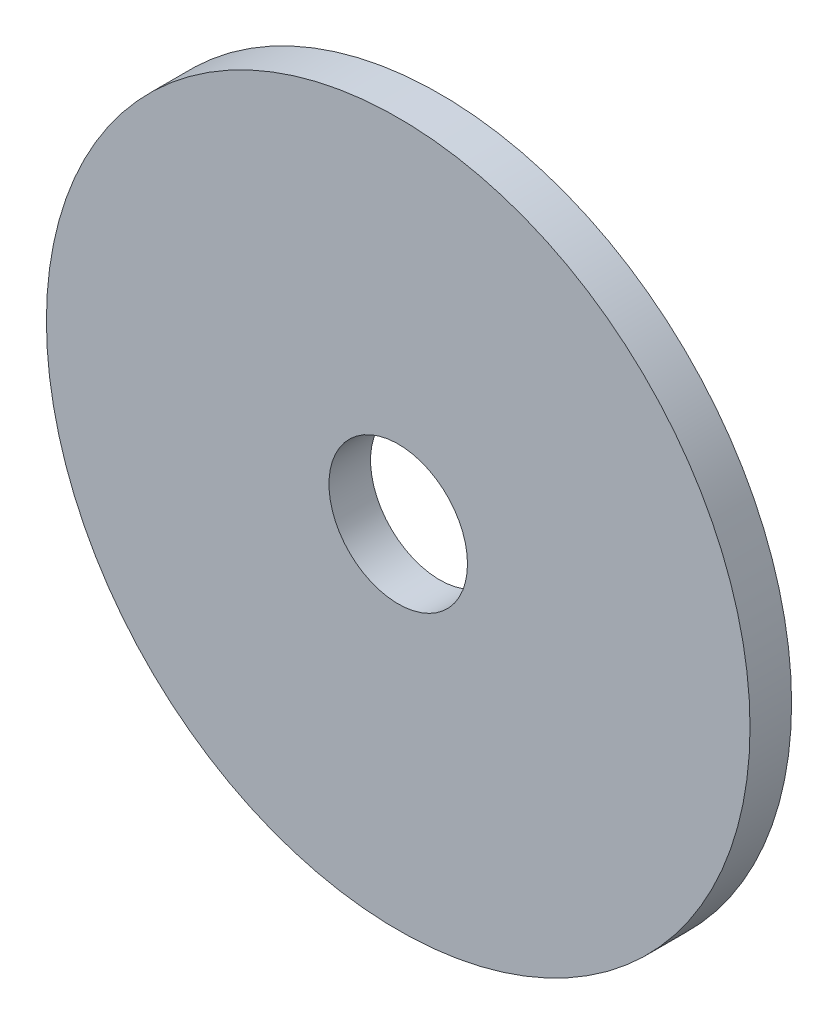
ISO-10303-21;
HEADER;
FILE_DESCRIPTION(('STEP AP214'),'2;1');
FILE_NAME('part.step','',(''),(''),'','','');
FILE_SCHEMA(('AUTOMOTIVE_DESIGN { 1 0 10303 214 1 1 1 1 }'));
ENDSEC;
DATA;
#1=APPLICATION_CONTEXT('core data for automotive mechanical design processes');
#2=APPLICATION_PROTOCOL_DEFINITION('international standard','automotive_design',2000,#1);
#3=PRODUCT_CONTEXT('',#1,'mechanical');
#4=PRODUCT('Part','Part','',(#3));
#5=PRODUCT_RELATED_PRODUCT_CATEGORY('part','',(#4));
#6=PRODUCT_DEFINITION_FORMATION('','',#4);
#7=PRODUCT_DEFINITION_CONTEXT('part definition',#1,'design');
#8=PRODUCT_DEFINITION('design','',#6,#7);
#9=PRODUCT_DEFINITION_SHAPE('','',#8);
#10=(LENGTH_UNIT() NAMED_UNIT(*) SI_UNIT(.MILLI.,.METRE.));
#11=(NAMED_UNIT(*) PLANE_ANGLE_UNIT() SI_UNIT($,.RADIAN.));
#12=(NAMED_UNIT(*) SI_UNIT($,.STERADIAN.) SOLID_ANGLE_UNIT());
#13=UNCERTAINTY_MEASURE_WITH_UNIT(LENGTH_MEASURE(1.E-05),#10,'distance_accuracy_value','');
#14=(GEOMETRIC_REPRESENTATION_CONTEXT(3) GLOBAL_UNCERTAINTY_ASSIGNED_CONTEXT((#13)) GLOBAL_UNIT_ASSIGNED_CONTEXT((#10,
#11,#12)) REPRESENTATION_CONTEXT('',''));
#15=CARTESIAN_POINT('',(0.,0.,0.));
#16=DIRECTION('',(0.,0.,1.));
#17=DIRECTION('',(1.,0.,0.));
#18=AXIS2_PLACEMENT_3D('',#15,#16,#17);
#19=CARTESIAN_POINT('',(0.,0.,1.5));
#20=DIRECTION('',(0.,0.,1.));
#21=DIRECTION('',(1.,0.,0.));
#22=AXIS2_PLACEMENT_3D('',#19,#20,#21);
#23=PLANE('',#22);
#24=CARTESIAN_POINT('',(0.,0.,1.5));
#25=DIRECTION('',(0.,0.,1.));
#26=DIRECTION('',(1.,0.,0.));
#27=AXIS2_PLACEMENT_3D('',#24,#25,#26);
#28=CIRCLE('',#27,12.7);
#29=CARTESIAN_POINT('',(12.7,0.,1.5));
#30=VERTEX_POINT('',#29);
#31=EDGE_CURVE('E10',#30,#30,#28,.T.);
#32=ORIENTED_EDGE('',*,*,#31,.T.);
#33=EDGE_LOOP('',(#32));
#34=FACE_BOUND('',#33,.T.);
#35=CARTESIAN_POINT('',(0.,0.,1.5));
#36=DIRECTION('',(0.,0.,1.));
#37=DIRECTION('',(1.,0.,0.));
#38=AXIS2_PLACEMENT_3D('',#35,#36,#37);
#39=CIRCLE('',#38,2.5);
#40=CARTESIAN_POINT('',(2.5,0.,1.5));
#41=VERTEX_POINT('',#40);
#42=EDGE_CURVE('E50',#41,#41,#39,.T.);
#43=ORIENTED_EDGE('',*,*,#42,.F.);
#44=EDGE_LOOP('',(#43));
#45=FACE_BOUND('',#44,.T.);
#46=ADVANCED_FACE('F39',(#34,#45),#23,.T.);
#47=CARTESIAN_POINT('',(0.,0.,0.));
#48=DIRECTION('',(0.,0.,1.));
#49=DIRECTION('',(1.,0.,0.));
#50=AXIS2_PLACEMENT_3D('',#47,#48,#49);
#51=PLANE('',#50);
#52=CARTESIAN_POINT('',(0.,0.,0.));
#53=DIRECTION('',(0.,0.,1.));
#54=DIRECTION('',(1.,0.,0.));
#55=AXIS2_PLACEMENT_3D('',#52,#53,#54);
#56=CIRCLE('',#55,12.7);
#57=CARTESIAN_POINT('',(12.7,0.,0.));
#58=VERTEX_POINT('',#57);
#59=EDGE_CURVE('E43',#58,#58,#56,.T.);
#60=ORIENTED_EDGE('',*,*,#59,.F.);
#61=EDGE_LOOP('',(#60));
#62=FACE_BOUND('',#61,.T.);
#63=CARTESIAN_POINT('',(0.,0.,0.));
#64=DIRECTION('',(0.,0.,1.));
#65=DIRECTION('',(1.,0.,0.));
#66=AXIS2_PLACEMENT_3D('',#63,#64,#65);
#67=CIRCLE('',#66,2.5);
#68=CARTESIAN_POINT('',(2.5,0.,0.));
#69=VERTEX_POINT('',#68);
#70=EDGE_CURVE('E52',#69,#69,#67,.T.);
#71=ORIENTED_EDGE('',*,*,#70,.T.);
#72=EDGE_LOOP('',(#71));
#73=FACE_BOUND('',#72,.T.);
#74=ADVANCED_FACE('F62',(#62,#73),#51,.F.);
#75=CARTESIAN_POINT('',(0.,0.,1.5));
#76=DIRECTION('',(0.,0.,-1.));
#77=DIRECTION('',(-1.,0.,0.));
#78=AXIS2_PLACEMENT_3D('',#75,#76,#77);
#79=CYLINDRICAL_SURFACE('',#78,12.7);
#80=ORIENTED_EDGE('',*,*,#31,.F.);
#81=EDGE_LOOP('',(#80));
#82=FACE_BOUND('',#81,.T.);
#83=ORIENTED_EDGE('',*,*,#59,.T.);
#84=EDGE_LOOP('',(#83));
#85=FACE_BOUND('',#84,.T.);
#86=ADVANCED_FACE('F41',(#82,#85),#79,.T.);
#87=CARTESIAN_POINT('',(0.,0.,1.5));
#88=DIRECTION('',(0.,0.,-1.));
#89=DIRECTION('',(-1.,0.,0.));
#90=AXIS2_PLACEMENT_3D('',#87,#88,#89);
#91=CYLINDRICAL_SURFACE('',#90,2.5);
#92=ORIENTED_EDGE('',*,*,#42,.T.);
#93=EDGE_LOOP('',(#92));
#94=FACE_BOUND('',#93,.T.);
#95=ORIENTED_EDGE('',*,*,#70,.F.);
#96=EDGE_LOOP('',(#95));
#97=FACE_BOUND('',#96,.T.);
#98=ADVANCED_FACE('F58',(#94,#97),#91,.F.);
#99=CLOSED_SHELL('',(#46,#74,#86,#98));
#100=MANIFOLD_SOLID_BREP('B2',#99);
#101=ADVANCED_BREP_SHAPE_REPRESENTATION('',(#18,#100),#14);
#102=SHAPE_DEFINITION_REPRESENTATION(#9,#101);
ENDSEC;
END-ISO-10303-21;
